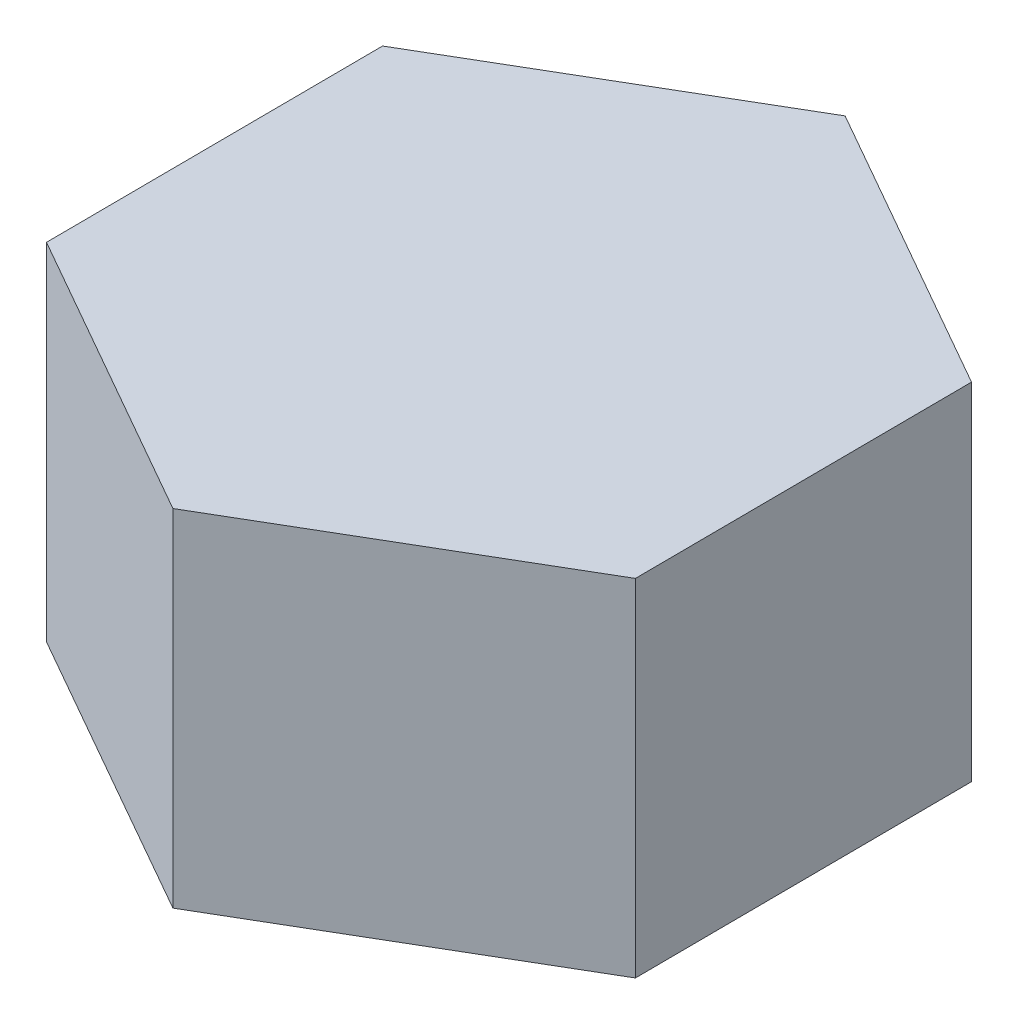
ISO-10303-21;
HEADER;
FILE_DESCRIPTION(('STEP AP214'),'2;1');
FILE_NAME('part.step','',(''),(''),'','','');
FILE_SCHEMA(('AUTOMOTIVE_DESIGN { 1 0 10303 214 1 1 1 1 }'));
ENDSEC;
DATA;
#1=APPLICATION_CONTEXT('core data for automotive mechanical design processes');
#2=APPLICATION_PROTOCOL_DEFINITION('international standard','automotive_design',2000,#1);
#3=PRODUCT_CONTEXT('',#1,'mechanical');
#4=PRODUCT('Part','Part','',(#3));
#5=PRODUCT_RELATED_PRODUCT_CATEGORY('part','',(#4));
#6=PRODUCT_DEFINITION_FORMATION('','',#4);
#7=PRODUCT_DEFINITION_CONTEXT('part definition',#1,'design');
#8=PRODUCT_DEFINITION('design','',#6,#7);
#9=PRODUCT_DEFINITION_SHAPE('','',#8);
#10=(LENGTH_UNIT() NAMED_UNIT(*) SI_UNIT(.MILLI.,.METRE.));
#11=(NAMED_UNIT(*) PLANE_ANGLE_UNIT() SI_UNIT($,.RADIAN.));
#12=(NAMED_UNIT(*) SI_UNIT($,.STERADIAN.) SOLID_ANGLE_UNIT());
#13=UNCERTAINTY_MEASURE_WITH_UNIT(LENGTH_MEASURE(1.E-05),#10,'distance_accuracy_value','');
#14=(GEOMETRIC_REPRESENTATION_CONTEXT(3) GLOBAL_UNCERTAINTY_ASSIGNED_CONTEXT((#13)) GLOBAL_UNIT_ASSIGNED_CONTEXT((#10,
#11,#12)) REPRESENTATION_CONTEXT('',''));
#15=CARTESIAN_POINT('',(0.,0.,0.));
#16=DIRECTION('',(0.,0.,1.));
#17=DIRECTION('',(1.,0.,0.));
#18=AXIS2_PLACEMENT_3D('',#15,#16,#17);
#19=CARTESIAN_POINT('',(0.0568520540427683,10.,9.768601120117));
#20=DIRECTION('',(-0.505031608186915,0.,-0.863100848529381));
#21=DIRECTION('',(-0.863100848529381,0.,0.505031608186915));
#22=AXIS2_PLACEMENT_3D('',#19,#20,#21);
#23=PLANE('',#22);
#24=DIRECTION('',(0.863100848529381,0.,-0.505031608186915));
#25=VECTOR('',#24,1.);
#26=CARTESIAN_POINT('',(0.0568520540427683,0.,9.768601120117));
#27=LINE('',#26,#25);
#28=CARTESIAN_POINT('',(0.0568520540427683,0.,9.768601120117));
#29=VERTEX_POINT('',#28);
#30=CARTESIAN_POINT('',(8.48828275647983,0.,4.83506523700013));
#31=VERTEX_POINT('',#30);
#32=EDGE_CURVE('E123',#29,#31,#27,.T.);
#33=ORIENTED_EDGE('',*,*,#32,.T.);
#34=DIRECTION('',(0.,-1.,0.));
#35=VECTOR('',#34,1.);
#36=CARTESIAN_POINT('',(8.48828275647983,10.,4.83506523700013));
#37=LINE('',#36,#35);
#38=CARTESIAN_POINT('',(8.48828275647983,10.,4.83506523700013));
#39=VERTEX_POINT('',#38);
#40=EDGE_CURVE('E11',#39,#31,#37,.T.);
#41=ORIENTED_EDGE('',*,*,#40,.F.);
#42=DIRECTION('',(0.863100848529381,0.,-0.505031608186915));
#43=VECTOR('',#42,1.);
#44=CARTESIAN_POINT('',(0.0568520540427683,10.,9.768601120117));
#45=LINE('',#44,#43);
#46=CARTESIAN_POINT('',(0.0568520540427683,10.,9.768601120117));
#47=VERTEX_POINT('',#46);
#48=EDGE_CURVE('E133',#47,#39,#45,.T.);
#49=ORIENTED_EDGE('',*,*,#48,.F.);
#50=DIRECTION('',(0.,-1.,0.));
#51=VECTOR('',#50,1.);
#52=CARTESIAN_POINT('',(0.0568520540427683,10.,9.768601120117));
#53=LINE('',#52,#51);
#54=EDGE_CURVE('E119',#47,#29,#53,.T.);
#55=ORIENTED_EDGE('',*,*,#54,.T.);
#56=EDGE_LOOP('',(#33,#41,#49,#55));
#57=FACE_BOUND('',#56,.T.);
#58=ADVANCED_FACE('F39',(#57),#23,.F.);
#59=CARTESIAN_POINT('',(8.48828275647983,10.,4.83506523700013));
#60=DIRECTION('',(-0.999983064947807,0.,0.00581977813928587));
#61=DIRECTION('',(0.00581977813928587,0.,0.999983064947807));
#62=AXIS2_PLACEMENT_3D('',#59,#60,#61);
#63=PLANE('',#62);
#64=DIRECTION('',(-0.00581977813928587,0.,-0.999983064947807));
#65=VECTOR('',#64,1.);
#66=CARTESIAN_POINT('',(8.48828275647983,0.,4.83506523700013));
#67=LINE('',#66,#65);
#68=CARTESIAN_POINT('',(8.43143070243707,0.,-4.93353588311687));
#69=VERTEX_POINT('',#68);
#70=EDGE_CURVE('E126',#31,#69,#67,.T.);
#71=ORIENTED_EDGE('',*,*,#70,.T.);
#72=DIRECTION('',(0.,-1.,0.));
#73=VECTOR('',#72,1.);
#74=CARTESIAN_POINT('',(8.43143070243707,10.,-4.93353588311687));
#75=LINE('',#74,#73);
#76=CARTESIAN_POINT('',(8.43143070243707,10.,-4.93353588311687));
#77=VERTEX_POINT('',#76);
#78=EDGE_CURVE('E47',#77,#69,#75,.T.);
#79=ORIENTED_EDGE('',*,*,#78,.F.);
#80=DIRECTION('',(-0.00581977813928587,0.,-0.999983064947807));
#81=VECTOR('',#80,1.);
#82=CARTESIAN_POINT('',(8.48828275647983,10.,4.83506523700013));
#83=LINE('',#82,#81);
#84=EDGE_CURVE('E92',#39,#77,#83,.T.);
#85=ORIENTED_EDGE('',*,*,#84,.F.);
#86=ORIENTED_EDGE('',*,*,#40,.T.);
#87=EDGE_LOOP('',(#71,#79,#85,#86));
#88=FACE_BOUND('',#87,.T.);
#89=ADVANCED_FACE('F157',(#88),#63,.F.);
#90=CARTESIAN_POINT('',(8.43143070243707,10.,-4.93353588311687));
#91=DIRECTION('',(-0.494951456760892,0.,0.868920626668668));
#92=DIRECTION('',(0.868920626668668,0.,0.494951456760892));
#93=AXIS2_PLACEMENT_3D('',#90,#91,#92);
#94=PLANE('',#93);
#95=DIRECTION('',(-0.868920626668668,0.,-0.494951456760892));
#96=VECTOR('',#95,1.);
#97=CARTESIAN_POINT('',(8.43143070243707,0.,-4.93353588311687));
#98=LINE('',#97,#96);
#99=CARTESIAN_POINT('',(-0.0568520540427683,0.,-9.76860112011701));
#100=VERTEX_POINT('',#99);
#101=EDGE_CURVE('E128',#69,#100,#98,.T.);
#102=ORIENTED_EDGE('',*,*,#101,.T.);
#103=DIRECTION('',(0.,-1.,0.));
#104=VECTOR('',#103,1.);
#105=CARTESIAN_POINT('',(-0.0568520540427683,10.,-9.76860112011701));
#106=LINE('',#105,#104);
#107=CARTESIAN_POINT('',(-0.0568520540427683,10.,-9.76860112011701));
#108=VERTEX_POINT('',#107);
#109=EDGE_CURVE('E114',#108,#100,#106,.T.);
#110=ORIENTED_EDGE('',*,*,#109,.F.);
#111=DIRECTION('',(-0.868920626668668,0.,-0.494951456760892));
#112=VECTOR('',#111,1.);
#113=CARTESIAN_POINT('',(8.43143070243707,10.,-4.93353588311687));
#114=LINE('',#113,#112);
#115=EDGE_CURVE('E105',#77,#108,#114,.T.);
#116=ORIENTED_EDGE('',*,*,#115,.F.);
#117=ORIENTED_EDGE('',*,*,#78,.T.);
#118=EDGE_LOOP('',(#102,#110,#116,#117));
#119=FACE_BOUND('',#118,.T.);
#120=ADVANCED_FACE('F139',(#119),#94,.F.);
#121=CARTESIAN_POINT('',(-0.0568520540427683,10.,-9.76860112011701));
#122=DIRECTION('',(0.505031608186915,0.,0.863100848529382));
#123=DIRECTION('',(0.863100848529382,0.,-0.505031608186915));
#124=AXIS2_PLACEMENT_3D('',#121,#122,#123);
#125=PLANE('',#124);
#126=DIRECTION('',(-0.863100848529382,0.,0.505031608186915));
#127=VECTOR('',#126,1.);
#128=CARTESIAN_POINT('',(-0.0568520540427683,0.,-9.76860112011701));
#129=LINE('',#128,#127);
#130=CARTESIAN_POINT('',(-8.48828275647984,0.,-4.83506523700014));
#131=VERTEX_POINT('',#130);
#132=EDGE_CURVE('E113',#100,#131,#129,.T.);
#133=ORIENTED_EDGE('',*,*,#132,.T.);
#134=DIRECTION('',(0.,-1.,0.));
#135=VECTOR('',#134,1.);
#136=CARTESIAN_POINT('',(-8.48828275647984,10.,-4.83506523700014));
#137=LINE('',#136,#135);
#138=CARTESIAN_POINT('',(-8.48828275647984,10.,-4.83506523700014));
#139=VERTEX_POINT('',#138);
#140=EDGE_CURVE('E110',#139,#131,#137,.T.);
#141=ORIENTED_EDGE('',*,*,#140,.F.);
#142=DIRECTION('',(-0.863100848529382,0.,0.505031608186915));
#143=VECTOR('',#142,1.);
#144=CARTESIAN_POINT('',(-0.0568520540427683,10.,-9.76860112011701));
#145=LINE('',#144,#143);
#146=EDGE_CURVE('E99',#108,#139,#145,.T.);
#147=ORIENTED_EDGE('',*,*,#146,.F.);
#148=ORIENTED_EDGE('',*,*,#109,.T.);
#149=EDGE_LOOP('',(#133,#141,#147,#148));
#150=FACE_BOUND('',#149,.T.);
#151=ADVANCED_FACE('F111',(#150),#125,.F.);
#152=CARTESIAN_POINT('',(-8.48828275647984,10.,-4.83506523700014));
#153=DIRECTION('',(0.999983064947807,0.,-0.00581977813928658));
#154=DIRECTION('',(-0.00581977813928658,0.,-0.999983064947807));
#155=AXIS2_PLACEMENT_3D('',#152,#153,#154);
#156=PLANE('',#155);
#157=DIRECTION('',(0.00581977813928658,0.,0.999983064947807));
#158=VECTOR('',#157,1.);
#159=CARTESIAN_POINT('',(-8.48828275647984,0.,-4.83506523700014));
#160=LINE('',#159,#158);
#161=CARTESIAN_POINT('',(-8.43143070243707,0.,4.93353588311687));
#162=VERTEX_POINT('',#161);
#163=EDGE_CURVE('E78',#131,#162,#160,.T.);
#164=ORIENTED_EDGE('',*,*,#163,.T.);
#165=DIRECTION('',(0.,-1.,0.));
#166=VECTOR('',#165,1.);
#167=CARTESIAN_POINT('',(-8.43143070243707,10.,4.93353588311687));
#168=LINE('',#167,#166);
#169=CARTESIAN_POINT('',(-8.43143070243707,10.,4.93353588311687));
#170=VERTEX_POINT('',#169);
#171=EDGE_CURVE('E115',#170,#162,#168,.T.);
#172=ORIENTED_EDGE('',*,*,#171,.F.);
#173=DIRECTION('',(0.00581977813928658,0.,0.999983064947807));
#174=VECTOR('',#173,1.);
#175=CARTESIAN_POINT('',(-8.48828275647984,10.,-4.83506523700014));
#176=LINE('',#175,#174);
#177=EDGE_CURVE('E103',#139,#170,#176,.T.);
#178=ORIENTED_EDGE('',*,*,#177,.F.);
#179=ORIENTED_EDGE('',*,*,#140,.T.);
#180=EDGE_LOOP('',(#164,#172,#178,#179));
#181=FACE_BOUND('',#180,.T.);
#182=ADVANCED_FACE('F117',(#181),#156,.F.);
#183=CARTESIAN_POINT('',(-8.43143070243707,10.,4.93353588311687));
#184=DIRECTION('',(0.494951456760891,0.,-0.868920626668669));
#185=DIRECTION('',(-0.868920626668669,0.,-0.494951456760891));
#186=AXIS2_PLACEMENT_3D('',#183,#184,#185);
#187=PLANE('',#186);
#188=DIRECTION('',(0.868920626668669,0.,0.494951456760891));
#189=VECTOR('',#188,1.);
#190=CARTESIAN_POINT('',(-8.43143070243707,0.,4.93353588311687));
#191=LINE('',#190,#189);
#192=EDGE_CURVE('E84',#162,#29,#191,.T.);
#193=ORIENTED_EDGE('',*,*,#192,.T.);
#194=ORIENTED_EDGE('',*,*,#54,.F.);
#195=DIRECTION('',(0.868920626668669,0.,0.494951456760891));
#196=VECTOR('',#195,1.);
#197=CARTESIAN_POINT('',(-8.43143070243707,10.,4.93353588311687));
#198=LINE('',#197,#196);
#199=EDGE_CURVE('E55',#170,#47,#198,.T.);
#200=ORIENTED_EDGE('',*,*,#199,.F.);
#201=ORIENTED_EDGE('',*,*,#171,.T.);
#202=EDGE_LOOP('',(#193,#194,#200,#201));
#203=FACE_BOUND('',#202,.T.);
#204=ADVANCED_FACE('F146',(#203),#187,.F.);
#205=CARTESIAN_POINT('',(0.,10.,0.));
#206=DIRECTION('',(0.,1.,0.));
#207=DIRECTION('',(0.,0.,1.));
#208=AXIS2_PLACEMENT_3D('',#205,#206,#207);
#209=PLANE('',#208);
#210=ORIENTED_EDGE('',*,*,#48,.T.);
#211=ORIENTED_EDGE('',*,*,#84,.T.);
#212=ORIENTED_EDGE('',*,*,#115,.T.);
#213=ORIENTED_EDGE('',*,*,#146,.T.);
#214=ORIENTED_EDGE('',*,*,#177,.T.);
#215=ORIENTED_EDGE('',*,*,#199,.T.);
#216=EDGE_LOOP('',(#210,#211,#212,#213,#214,#215));
#217=FACE_BOUND('',#216,.T.);
#218=ADVANCED_FACE('F101',(#217),#209,.T.);
#219=CARTESIAN_POINT('',(0.,0.,0.));
#220=DIRECTION('',(0.,1.,0.));
#221=DIRECTION('',(0.,0.,1.));
#222=AXIS2_PLACEMENT_3D('',#219,#220,#221);
#223=PLANE('',#222);
#224=ORIENTED_EDGE('',*,*,#32,.F.);
#225=ORIENTED_EDGE('',*,*,#192,.F.);
#226=ORIENTED_EDGE('',*,*,#163,.F.);
#227=ORIENTED_EDGE('',*,*,#132,.F.);
#228=ORIENTED_EDGE('',*,*,#101,.F.);
#229=ORIENTED_EDGE('',*,*,#70,.F.);
#230=EDGE_LOOP('',(#224,#225,#226,#227,#228,#229));
#231=FACE_BOUND('',#230,.T.);
#232=ADVANCED_FACE('F142',(#231),#223,.F.);
#233=CLOSED_SHELL('',(#58,#89,#120,#151,#182,#204,#218,#232));
#234=MANIFOLD_SOLID_BREP('B2',#233);
#235=ADVANCED_BREP_SHAPE_REPRESENTATION('',(#18,#234),#14);
#236=SHAPE_DEFINITION_REPRESENTATION(#9,#235);
ENDSEC;
END-ISO-10303-21;
